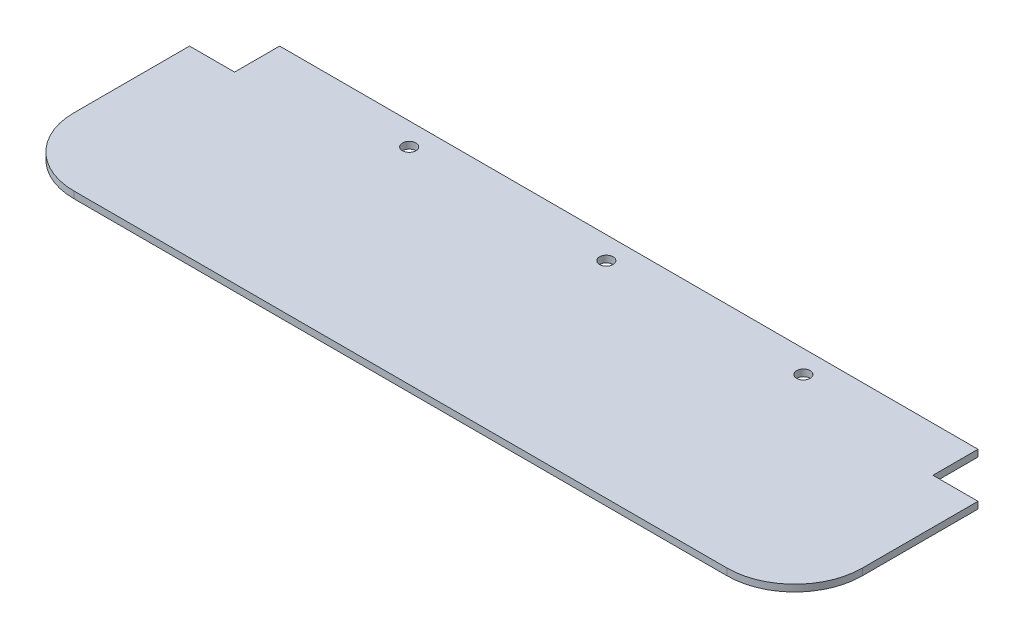
ISO-10303-21;
HEADER;
FILE_DESCRIPTION(('STEP AP214'),'2;1');
FILE_NAME('part.step','',(''),(''),'','','');
FILE_SCHEMA(('AUTOMOTIVE_DESIGN { 1 0 10303 214 1 1 1 1 }'));
ENDSEC;
DATA;
#1=APPLICATION_CONTEXT('core data for automotive mechanical design processes');
#2=APPLICATION_PROTOCOL_DEFINITION('international standard','automotive_design',2000,#1);
#3=PRODUCT_CONTEXT('',#1,'mechanical');
#4=PRODUCT('Part','Part','',(#3));
#5=PRODUCT_RELATED_PRODUCT_CATEGORY('part','',(#4));
#6=PRODUCT_DEFINITION_FORMATION('','',#4);
#7=PRODUCT_DEFINITION_CONTEXT('part definition',#1,'design');
#8=PRODUCT_DEFINITION('design','',#6,#7);
#9=PRODUCT_DEFINITION_SHAPE('','',#8);
#10=(LENGTH_UNIT() NAMED_UNIT(*) SI_UNIT(.MILLI.,.METRE.));
#11=(NAMED_UNIT(*) PLANE_ANGLE_UNIT() SI_UNIT($,.RADIAN.));
#12=(NAMED_UNIT(*) SI_UNIT($,.STERADIAN.) SOLID_ANGLE_UNIT());
#13=UNCERTAINTY_MEASURE_WITH_UNIT(LENGTH_MEASURE(1.E-05),#10,'distance_accuracy_value','');
#14=(GEOMETRIC_REPRESENTATION_CONTEXT(3) GLOBAL_UNCERTAINTY_ASSIGNED_CONTEXT((#13)) GLOBAL_UNIT_ASSIGNED_CONTEXT((#10,
#11,#12)) REPRESENTATION_CONTEXT('',''));
#15=CARTESIAN_POINT('',(0.,0.,0.));
#16=DIRECTION('',(0.,0.,1.));
#17=DIRECTION('',(1.,0.,0.));
#18=AXIS2_PLACEMENT_3D('',#15,#16,#17);
#19=CARTESIAN_POINT('',(175.,3.,50.685));
#20=DIRECTION('',(-1.,0.,0.));
#21=DIRECTION('',(0.,0.,1.));
#22=AXIS2_PLACEMENT_3D('',#19,#20,#21);
#23=PLANE('',#22);
#24=DIRECTION('',(0.,0.,-1.));
#25=VECTOR('',#24,1.);
#26=CARTESIAN_POINT('',(175.,3.,50.685));
#27=LINE('',#26,#25);
#28=CARTESIAN_POINT('',(175.,3.,20.685));
#29=VERTEX_POINT('',#28);
#30=CARTESIAN_POINT('',(175.,3.,-30.685));
#31=VERTEX_POINT('',#30);
#32=EDGE_CURVE('E149',#29,#31,#27,.T.);
#33=ORIENTED_EDGE('',*,*,#32,.F.);
#34=DIRECTION('',(0.,-1.,0.));
#35=VECTOR('',#34,1.);
#36=CARTESIAN_POINT('',(175.,3.,20.685));
#37=LINE('',#36,#35);
#38=CARTESIAN_POINT('',(175.,0.,20.685));
#39=VERTEX_POINT('',#38);
#40=EDGE_CURVE('E156',#29,#39,#37,.T.);
#41=ORIENTED_EDGE('',*,*,#40,.T.);
#42=DIRECTION('',(0.,0.,-1.));
#43=VECTOR('',#42,1.);
#44=CARTESIAN_POINT('',(175.,0.,50.685));
#45=LINE('',#44,#43);
#46=CARTESIAN_POINT('',(175.,0.,-30.685));
#47=VERTEX_POINT('',#46);
#48=EDGE_CURVE('E152',#39,#47,#45,.T.);
#49=ORIENTED_EDGE('',*,*,#48,.T.);
#50=DIRECTION('',(0.,1.,0.));
#51=VECTOR('',#50,1.);
#52=CARTESIAN_POINT('',(175.,0.,-30.685));
#53=LINE('',#52,#51);
#54=EDGE_CURVE('E186',#47,#31,#53,.T.);
#55=ORIENTED_EDGE('',*,*,#54,.T.);
#56=EDGE_LOOP('',(#33,#41,#49,#55));
#57=FACE_BOUND('',#56,.T.);
#58=ADVANCED_FACE('F39',(#57),#23,.F.);
#59=CARTESIAN_POINT('',(-175.,3.,-50.685));
#60=DIRECTION('',(0.,0.,1.));
#61=DIRECTION('',(1.,0.,0.));
#62=AXIS2_PLACEMENT_3D('',#59,#60,#61);
#63=PLANE('',#62);
#64=DIRECTION('',(-1.,0.,0.));
#65=VECTOR('',#64,1.);
#66=CARTESIAN_POINT('',(-175.,0.,-50.685));
#67=LINE('',#66,#65);
#68=CARTESIAN_POINT('',(155.,0.,-50.685));
#69=VERTEX_POINT('',#68);
#70=CARTESIAN_POINT('',(-155.,0.,-50.685));
#71=VERTEX_POINT('',#70);
#72=EDGE_CURVE('E145',#69,#71,#67,.T.);
#73=ORIENTED_EDGE('',*,*,#72,.T.);
#74=DIRECTION('',(0.,1.,0.));
#75=VECTOR('',#74,1.);
#76=CARTESIAN_POINT('',(-155.,0.,-50.685));
#77=LINE('',#76,#75);
#78=CARTESIAN_POINT('',(-155.,3.,-50.685));
#79=VERTEX_POINT('',#78);
#80=EDGE_CURVE('E206',#71,#79,#77,.T.);
#81=ORIENTED_EDGE('',*,*,#80,.T.);
#82=DIRECTION('',(-1.,0.,0.));
#83=VECTOR('',#82,1.);
#84=CARTESIAN_POINT('',(-175.,3.,-50.685));
#85=LINE('',#84,#83);
#86=CARTESIAN_POINT('',(155.,3.,-50.685));
#87=VERTEX_POINT('',#86);
#88=EDGE_CURVE('E188',#87,#79,#85,.T.);
#89=ORIENTED_EDGE('',*,*,#88,.F.);
#90=DIRECTION('',(0.,1.,0.));
#91=VECTOR('',#90,1.);
#92=CARTESIAN_POINT('',(155.,0.,-50.685));
#93=LINE('',#92,#91);
#94=EDGE_CURVE('E242',#69,#87,#93,.T.);
#95=ORIENTED_EDGE('',*,*,#94,.F.);
#96=EDGE_LOOP('',(#73,#81,#89,#95));
#97=FACE_BOUND('',#96,.T.);
#98=ADVANCED_FACE('F280',(#97),#63,.F.);
#99=CARTESIAN_POINT('',(-175.,3.,50.685));
#100=DIRECTION('',(1.,0.,0.));
#101=DIRECTION('',(0.,0.,-1.));
#102=AXIS2_PLACEMENT_3D('',#99,#100,#101);
#103=PLANE('',#102);
#104=DIRECTION('',(0.,0.,1.));
#105=VECTOR('',#104,1.);
#106=CARTESIAN_POINT('',(-175.,0.,50.685));
#107=LINE('',#106,#105);
#108=CARTESIAN_POINT('',(-175.,0.,-30.685));
#109=VERTEX_POINT('',#108);
#110=CARTESIAN_POINT('',(-175.,0.,20.685));
#111=VERTEX_POINT('',#110);
#112=EDGE_CURVE('E134',#109,#111,#107,.T.);
#113=ORIENTED_EDGE('',*,*,#112,.T.);
#114=DIRECTION('',(0.,-1.,0.));
#115=VECTOR('',#114,1.);
#116=CARTESIAN_POINT('',(-175.,3.,20.685));
#117=LINE('',#116,#115);
#118=CARTESIAN_POINT('',(-175.,3.,20.685));
#119=VERTEX_POINT('',#118);
#120=EDGE_CURVE('E11',#111,#119,#117,.F.);
#121=ORIENTED_EDGE('',*,*,#120,.T.);
#122=DIRECTION('',(0.,0.,1.));
#123=VECTOR('',#122,1.);
#124=CARTESIAN_POINT('',(-175.,3.,50.685));
#125=LINE('',#124,#123);
#126=CARTESIAN_POINT('',(-175.,3.,-30.685));
#127=VERTEX_POINT('',#126);
#128=EDGE_CURVE('E135',#127,#119,#125,.T.);
#129=ORIENTED_EDGE('',*,*,#128,.F.);
#130=DIRECTION('',(0.,1.,0.));
#131=VECTOR('',#130,1.);
#132=CARTESIAN_POINT('',(-175.,0.,-30.685));
#133=LINE('',#132,#131);
#134=EDGE_CURVE('E123',#109,#127,#133,.T.);
#135=ORIENTED_EDGE('',*,*,#134,.F.);
#136=EDGE_LOOP('',(#113,#121,#129,#135));
#137=FACE_BOUND('',#136,.T.);
#138=ADVANCED_FACE('F133',(#137),#103,.F.);
#139=CARTESIAN_POINT('',(-175.,3.,50.685));
#140=DIRECTION('',(0.,0.,-1.));
#141=DIRECTION('',(-1.,0.,0.));
#142=AXIS2_PLACEMENT_3D('',#139,#140,#141);
#143=PLANE('',#142);
#144=DIRECTION('',(1.,0.,0.));
#145=VECTOR('',#144,1.);
#146=CARTESIAN_POINT('',(-175.,0.,50.685));
#147=LINE('',#146,#145);
#148=CARTESIAN_POINT('',(-145.,0.,50.685));
#149=VERTEX_POINT('',#148);
#150=CARTESIAN_POINT('',(145.,0.,50.685));
#151=VERTEX_POINT('',#150);
#152=EDGE_CURVE('E144',#149,#151,#147,.T.);
#153=ORIENTED_EDGE('',*,*,#152,.T.);
#154=DIRECTION('',(0.,-1.,0.));
#155=VECTOR('',#154,1.);
#156=CARTESIAN_POINT('',(145.,3.,50.685));
#157=LINE('',#156,#155);
#158=CARTESIAN_POINT('',(145.,3.,50.685));
#159=VERTEX_POINT('',#158);
#160=EDGE_CURVE('E61',#151,#159,#157,.F.);
#161=ORIENTED_EDGE('',*,*,#160,.T.);
#162=DIRECTION('',(1.,0.,0.));
#163=VECTOR('',#162,1.);
#164=CARTESIAN_POINT('',(-175.,3.,50.685));
#165=LINE('',#164,#163);
#166=CARTESIAN_POINT('',(-145.,3.,50.685));
#167=VERTEX_POINT('',#166);
#168=EDGE_CURVE('E160',#167,#159,#165,.T.);
#169=ORIENTED_EDGE('',*,*,#168,.F.);
#170=DIRECTION('',(0.,-1.,0.));
#171=VECTOR('',#170,1.);
#172=CARTESIAN_POINT('',(-145.,3.,50.685));
#173=LINE('',#172,#171);
#174=EDGE_CURVE('E166',#167,#149,#173,.T.);
#175=ORIENTED_EDGE('',*,*,#174,.T.);
#176=EDGE_LOOP('',(#153,#161,#169,#175));
#177=FACE_BOUND('',#176,.T.);
#178=ADVANCED_FACE('F192',(#177),#143,.F.);
#179=CARTESIAN_POINT('',(0.,3.,0.));
#180=DIRECTION('',(0.,-1.,0.));
#181=DIRECTION('',(0.,0.,-1.));
#182=AXIS2_PLACEMENT_3D('',#179,#180,#181);
#183=PLANE('',#182);
#184=CARTESIAN_POINT('',(87.5,3.,-40.685));
#185=DIRECTION('',(0.,1.,0.));
#186=DIRECTION('',(0.,0.,1.));
#187=AXIS2_PLACEMENT_3D('',#184,#185,#186);
#188=CIRCLE('',#187,3.00000000000001);
#189=CARTESIAN_POINT('',(87.5,3.,-37.685));
#190=VERTEX_POINT('',#189);
#191=EDGE_CURVE('E230',#190,#190,#188,.T.);
#192=ORIENTED_EDGE('',*,*,#191,.F.);
#193=EDGE_LOOP('',(#192));
#194=FACE_BOUND('',#193,.T.);
#195=CARTESIAN_POINT('',(0.,3.,-40.685));
#196=DIRECTION('',(0.,1.,0.));
#197=DIRECTION('',(0.,0.,1.));
#198=AXIS2_PLACEMENT_3D('',#195,#196,#197);
#199=CIRCLE('',#198,3.);
#200=CARTESIAN_POINT('',(0.,3.,-37.685));
#201=VERTEX_POINT('',#200);
#202=EDGE_CURVE('E222',#201,#201,#199,.T.);
#203=ORIENTED_EDGE('',*,*,#202,.F.);
#204=EDGE_LOOP('',(#203));
#205=FACE_BOUND('',#204,.T.);
#206=CARTESIAN_POINT('',(-87.5,3.,-40.685));
#207=DIRECTION('',(0.,1.,0.));
#208=DIRECTION('',(0.,0.,1.));
#209=AXIS2_PLACEMENT_3D('',#206,#207,#208);
#210=CIRCLE('',#209,3.00000000000001);
#211=CARTESIAN_POINT('',(-87.5,3.,-37.685));
#212=VERTEX_POINT('',#211);
#213=EDGE_CURVE('E221',#212,#212,#210,.T.);
#214=ORIENTED_EDGE('',*,*,#213,.F.);
#215=EDGE_LOOP('',(#214));
#216=FACE_BOUND('',#215,.T.);
#217=ORIENTED_EDGE('',*,*,#168,.T.);
#218=CARTESIAN_POINT('',(145.,3.,20.685));
#219=DIRECTION('',(0.,-1.,0.));
#220=DIRECTION('',(0.,0.,-1.));
#221=AXIS2_PLACEMENT_3D('',#218,#219,#220);
#222=CIRCLE('',#221,30.);
#223=EDGE_CURVE('E48',#159,#29,#222,.F.);
#224=ORIENTED_EDGE('',*,*,#223,.T.);
#225=ORIENTED_EDGE('',*,*,#32,.T.);
#226=DIRECTION('',(1.,0.,0.));
#227=VECTOR('',#226,1.);
#228=CARTESIAN_POINT('',(175.,3.,-30.685));
#229=LINE('',#228,#227);
#230=CARTESIAN_POINT('',(155.,3.,-30.685));
#231=VERTEX_POINT('',#230);
#232=EDGE_CURVE('E239',#231,#31,#229,.T.);
#233=ORIENTED_EDGE('',*,*,#232,.F.);
#234=DIRECTION('',(0.,0.,1.));
#235=VECTOR('',#234,1.);
#236=CARTESIAN_POINT('',(155.,3.,-50.685));
#237=LINE('',#236,#235);
#238=EDGE_CURVE('E243',#87,#231,#237,.T.);
#239=ORIENTED_EDGE('',*,*,#238,.F.);
#240=ORIENTED_EDGE('',*,*,#88,.T.);
#241=DIRECTION('',(0.,0.,-1.));
#242=VECTOR('',#241,1.);
#243=CARTESIAN_POINT('',(-155.,3.,-50.685));
#244=LINE('',#243,#242);
#245=CARTESIAN_POINT('',(-155.,3.,-30.685));
#246=VERTEX_POINT('',#245);
#247=EDGE_CURVE('E131',#246,#79,#244,.T.);
#248=ORIENTED_EDGE('',*,*,#247,.F.);
#249=DIRECTION('',(1.,0.,0.));
#250=VECTOR('',#249,1.);
#251=CARTESIAN_POINT('',(-175.,3.,-30.685));
#252=LINE('',#251,#250);
#253=EDGE_CURVE('E197',#127,#246,#252,.T.);
#254=ORIENTED_EDGE('',*,*,#253,.F.);
#255=ORIENTED_EDGE('',*,*,#128,.T.);
#256=CARTESIAN_POINT('',(-145.,3.,20.685));
#257=DIRECTION('',(0.,-1.,0.));
#258=DIRECTION('',(0.,0.,-1.));
#259=AXIS2_PLACEMENT_3D('',#256,#257,#258);
#260=CIRCLE('',#259,30.);
#261=EDGE_CURVE('E172',#119,#167,#260,.F.);
#262=ORIENTED_EDGE('',*,*,#261,.T.);
#263=EDGE_LOOP('',(#217,#224,#225,#233,#239,#240,#248,#254,#255,#262));
#264=FACE_BOUND('',#263,.T.);
#265=ADVANCED_FACE('F178',(#194,#205,#216,#264),#183,.F.);
#266=CARTESIAN_POINT('',(0.,0.,0.));
#267=DIRECTION('',(0.,-1.,0.));
#268=DIRECTION('',(0.,0.,-1.));
#269=AXIS2_PLACEMENT_3D('',#266,#267,#268);
#270=PLANE('',#269);
#271=ORIENTED_EDGE('',*,*,#48,.F.);
#272=CARTESIAN_POINT('',(145.,0.,20.685));
#273=DIRECTION('',(0.,-1.,0.));
#274=DIRECTION('',(0.,0.,-1.));
#275=AXIS2_PLACEMENT_3D('',#272,#273,#274);
#276=CIRCLE('',#275,30.);
#277=EDGE_CURVE('E163',#39,#151,#276,.T.);
#278=ORIENTED_EDGE('',*,*,#277,.T.);
#279=ORIENTED_EDGE('',*,*,#152,.F.);
#280=CARTESIAN_POINT('',(-145.,0.,20.685));
#281=DIRECTION('',(0.,-1.,0.));
#282=DIRECTION('',(0.,0.,-1.));
#283=AXIS2_PLACEMENT_3D('',#280,#281,#282);
#284=CIRCLE('',#283,30.);
#285=EDGE_CURVE('E142',#149,#111,#284,.T.);
#286=ORIENTED_EDGE('',*,*,#285,.T.);
#287=ORIENTED_EDGE('',*,*,#112,.F.);
#288=DIRECTION('',(1.,0.,0.));
#289=VECTOR('',#288,1.);
#290=CARTESIAN_POINT('',(-175.,0.,-30.685));
#291=LINE('',#290,#289);
#292=CARTESIAN_POINT('',(-155.,0.,-30.685));
#293=VERTEX_POINT('',#292);
#294=EDGE_CURVE('E119',#109,#293,#291,.T.);
#295=ORIENTED_EDGE('',*,*,#294,.T.);
#296=DIRECTION('',(0.,0.,-1.));
#297=VECTOR('',#296,1.);
#298=CARTESIAN_POINT('',(-155.,0.,-50.685));
#299=LINE('',#298,#297);
#300=EDGE_CURVE('E130',#293,#71,#299,.T.);
#301=ORIENTED_EDGE('',*,*,#300,.T.);
#302=ORIENTED_EDGE('',*,*,#72,.F.);
#303=DIRECTION('',(0.,0.,1.));
#304=VECTOR('',#303,1.);
#305=CARTESIAN_POINT('',(155.,0.,-50.685));
#306=LINE('',#305,#304);
#307=CARTESIAN_POINT('',(155.,0.,-30.685));
#308=VERTEX_POINT('',#307);
#309=EDGE_CURVE('E234',#69,#308,#306,.T.);
#310=ORIENTED_EDGE('',*,*,#309,.T.);
#311=DIRECTION('',(1.,0.,0.));
#312=VECTOR('',#311,1.);
#313=CARTESIAN_POINT('',(175.,0.,-30.685));
#314=LINE('',#313,#312);
#315=EDGE_CURVE('E238',#308,#47,#314,.T.);
#316=ORIENTED_EDGE('',*,*,#315,.T.);
#317=EDGE_LOOP('',(#271,#278,#279,#286,#287,#295,#301,#302,#310,#316));
#318=FACE_BOUND('',#317,.T.);
#319=CARTESIAN_POINT('',(87.5,0.,-40.685));
#320=DIRECTION('',(0.,1.,0.));
#321=DIRECTION('',(0.,0.,1.));
#322=AXIS2_PLACEMENT_3D('',#319,#320,#321);
#323=CIRCLE('',#322,3.00000000000001);
#324=CARTESIAN_POINT('',(87.5,0.,-37.685));
#325=VERTEX_POINT('',#324);
#326=EDGE_CURVE('E226',#325,#325,#323,.T.);
#327=ORIENTED_EDGE('',*,*,#326,.T.);
#328=EDGE_LOOP('',(#327));
#329=FACE_BOUND('',#328,.T.);
#330=CARTESIAN_POINT('',(0.,0.,-40.685));
#331=DIRECTION('',(0.,1.,0.));
#332=DIRECTION('',(0.,0.,1.));
#333=AXIS2_PLACEMENT_3D('',#330,#331,#332);
#334=CIRCLE('',#333,3.);
#335=CARTESIAN_POINT('',(0.,0.,-37.685));
#336=VERTEX_POINT('',#335);
#337=EDGE_CURVE('E217',#336,#336,#334,.T.);
#338=ORIENTED_EDGE('',*,*,#337,.T.);
#339=EDGE_LOOP('',(#338));
#340=FACE_BOUND('',#339,.T.);
#341=CARTESIAN_POINT('',(-87.5,0.,-40.685));
#342=DIRECTION('',(0.,1.,0.));
#343=DIRECTION('',(0.,0.,1.));
#344=AXIS2_PLACEMENT_3D('',#341,#342,#343);
#345=CIRCLE('',#344,3.00000000000001);
#346=CARTESIAN_POINT('',(-87.5,0.,-37.685));
#347=VERTEX_POINT('',#346);
#348=EDGE_CURVE('E247',#347,#347,#345,.T.);
#349=ORIENTED_EDGE('',*,*,#348,.T.);
#350=EDGE_LOOP('',(#349));
#351=FACE_BOUND('',#350,.T.);
#352=ADVANCED_FACE('F139',(#318,#329,#340,#351),#270,.T.);
#353=CARTESIAN_POINT('',(175.,0.,-30.685));
#354=DIRECTION('',(0.,0.,1.));
#355=DIRECTION('',(1.,0.,0.));
#356=AXIS2_PLACEMENT_3D('',#353,#354,#355);
#357=PLANE('',#356);
#358=ORIENTED_EDGE('',*,*,#232,.T.);
#359=ORIENTED_EDGE('',*,*,#54,.F.);
#360=ORIENTED_EDGE('',*,*,#315,.F.);
#361=DIRECTION('',(0.,1.,0.));
#362=VECTOR('',#361,1.);
#363=CARTESIAN_POINT('',(155.,0.,-30.685));
#364=LINE('',#363,#362);
#365=EDGE_CURVE('E252',#308,#231,#364,.T.);
#366=ORIENTED_EDGE('',*,*,#365,.T.);
#367=EDGE_LOOP('',(#358,#359,#360,#366));
#368=FACE_BOUND('',#367,.T.);
#369=ADVANCED_FACE('F273',(#368),#357,.F.);
#370=CARTESIAN_POINT('',(155.,0.,-50.685));
#371=DIRECTION('',(-1.,0.,0.));
#372=DIRECTION('',(0.,0.,1.));
#373=AXIS2_PLACEMENT_3D('',#370,#371,#372);
#374=PLANE('',#373);
#375=ORIENTED_EDGE('',*,*,#238,.T.);
#376=ORIENTED_EDGE('',*,*,#365,.F.);
#377=ORIENTED_EDGE('',*,*,#309,.F.);
#378=ORIENTED_EDGE('',*,*,#94,.T.);
#379=EDGE_LOOP('',(#375,#376,#377,#378));
#380=FACE_BOUND('',#379,.T.);
#381=ADVANCED_FACE('F310',(#380),#374,.F.);
#382=CARTESIAN_POINT('',(-87.5,0.,-40.685));
#383=DIRECTION('',(0.,1.,0.));
#384=DIRECTION('',(0.,0.,1.));
#385=AXIS2_PLACEMENT_3D('',#382,#383,#384);
#386=CYLINDRICAL_SURFACE('',#385,3.00000000000001);
#387=ORIENTED_EDGE('',*,*,#348,.F.);
#388=EDGE_LOOP('',(#387));
#389=FACE_BOUND('',#388,.T.);
#390=ORIENTED_EDGE('',*,*,#213,.T.);
#391=EDGE_LOOP('',(#390));
#392=FACE_BOUND('',#391,.T.);
#393=ADVANCED_FACE('F264',(#389,#392),#386,.F.);
#394=CARTESIAN_POINT('',(0.,0.,-40.685));
#395=DIRECTION('',(0.,1.,0.));
#396=DIRECTION('',(0.,0.,1.));
#397=AXIS2_PLACEMENT_3D('',#394,#395,#396);
#398=CYLINDRICAL_SURFACE('',#397,3.);
#399=ORIENTED_EDGE('',*,*,#337,.F.);
#400=EDGE_LOOP('',(#399));
#401=FACE_BOUND('',#400,.T.);
#402=ORIENTED_EDGE('',*,*,#202,.T.);
#403=EDGE_LOOP('',(#402));
#404=FACE_BOUND('',#403,.T.);
#405=ADVANCED_FACE('F301',(#401,#404),#398,.F.);
#406=CARTESIAN_POINT('',(87.5,0.,-40.685));
#407=DIRECTION('',(0.,1.,0.));
#408=DIRECTION('',(0.,0.,1.));
#409=AXIS2_PLACEMENT_3D('',#406,#407,#408);
#410=CYLINDRICAL_SURFACE('',#409,3.00000000000001);
#411=ORIENTED_EDGE('',*,*,#326,.F.);
#412=EDGE_LOOP('',(#411));
#413=FACE_BOUND('',#412,.T.);
#414=ORIENTED_EDGE('',*,*,#191,.T.);
#415=EDGE_LOOP('',(#414));
#416=FACE_BOUND('',#415,.T.);
#417=ADVANCED_FACE('F297',(#413,#416),#410,.F.);
#418=CARTESIAN_POINT('',(-155.,0.,-50.685));
#419=DIRECTION('',(1.,0.,0.));
#420=DIRECTION('',(0.,0.,-1.));
#421=AXIS2_PLACEMENT_3D('',#418,#419,#420);
#422=PLANE('',#421);
#423=ORIENTED_EDGE('',*,*,#247,.T.);
#424=ORIENTED_EDGE('',*,*,#80,.F.);
#425=ORIENTED_EDGE('',*,*,#300,.F.);
#426=DIRECTION('',(0.,1.,0.));
#427=VECTOR('',#426,1.);
#428=CARTESIAN_POINT('',(-155.,0.,-30.685));
#429=LINE('',#428,#427);
#430=EDGE_CURVE('E125',#293,#246,#429,.T.);
#431=ORIENTED_EDGE('',*,*,#430,.T.);
#432=EDGE_LOOP('',(#423,#424,#425,#431));
#433=FACE_BOUND('',#432,.T.);
#434=ADVANCED_FACE('F292',(#433),#422,.F.);
#435=CARTESIAN_POINT('',(-175.,0.,-30.685));
#436=DIRECTION('',(0.,0.,1.));
#437=DIRECTION('',(1.,0.,0.));
#438=AXIS2_PLACEMENT_3D('',#435,#436,#437);
#439=PLANE('',#438);
#440=ORIENTED_EDGE('',*,*,#253,.T.);
#441=ORIENTED_EDGE('',*,*,#430,.F.);
#442=ORIENTED_EDGE('',*,*,#294,.F.);
#443=ORIENTED_EDGE('',*,*,#134,.T.);
#444=EDGE_LOOP('',(#440,#441,#442,#443));
#445=FACE_BOUND('',#444,.T.);
#446=ADVANCED_FACE('F122',(#445),#439,.F.);
#447=CARTESIAN_POINT('',(145.,3.,20.685));
#448=DIRECTION('',(0.,-1.,0.));
#449=DIRECTION('',(0.,0.,-1.));
#450=AXIS2_PLACEMENT_3D('',#447,#448,#449);
#451=CYLINDRICAL_SURFACE('',#450,30.);
#452=ORIENTED_EDGE('',*,*,#223,.F.);
#453=ORIENTED_EDGE('',*,*,#160,.F.);
#454=ORIENTED_EDGE('',*,*,#277,.F.);
#455=ORIENTED_EDGE('',*,*,#40,.F.);
#456=EDGE_LOOP('',(#452,#453,#454,#455));
#457=FACE_BOUND('',#456,.T.);
#458=ADVANCED_FACE('F190',(#457),#451,.T.);
#459=CARTESIAN_POINT('',(-145.,3.,20.685));
#460=DIRECTION('',(0.,-1.,0.));
#461=DIRECTION('',(0.,0.,-1.));
#462=AXIS2_PLACEMENT_3D('',#459,#460,#461);
#463=CYLINDRICAL_SURFACE('',#462,30.);
#464=ORIENTED_EDGE('',*,*,#261,.F.);
#465=ORIENTED_EDGE('',*,*,#120,.F.);
#466=ORIENTED_EDGE('',*,*,#285,.F.);
#467=ORIENTED_EDGE('',*,*,#174,.F.);
#468=EDGE_LOOP('',(#464,#465,#466,#467));
#469=FACE_BOUND('',#468,.T.);
#470=ADVANCED_FACE('F41',(#469),#463,.T.);
#471=CLOSED_SHELL('',(#58,#98,#138,#178,#265,#352,#369,#381,#393,#405,#417,#434,#446,#458,#470));
#472=MANIFOLD_SOLID_BREP('B2',#471);
#473=ADVANCED_BREP_SHAPE_REPRESENTATION('',(#18,#472),#14);
#474=SHAPE_DEFINITION_REPRESENTATION(#9,#473);
ENDSEC;
END-ISO-10303-21;
